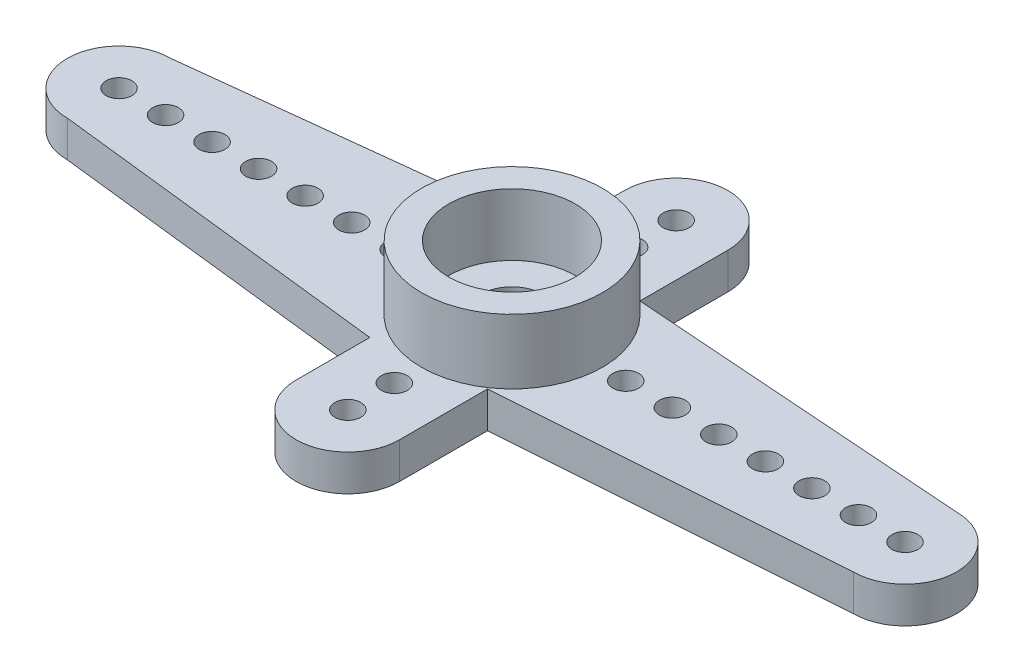
ISO-10303-21;
HEADER;
FILE_DESCRIPTION(('STEP AP214'),'2;1');
FILE_NAME('part.step','',(''),(''),'','','');
FILE_SCHEMA(('AUTOMOTIVE_DESIGN { 1 0 10303 214 1 1 1 1 }'));
ENDSEC;
DATA;
#1=APPLICATION_CONTEXT('core data for automotive mechanical design processes');
#2=APPLICATION_PROTOCOL_DEFINITION('international standard','automotive_design',2000,#1);
#3=PRODUCT_CONTEXT('',#1,'mechanical');
#4=PRODUCT('Part','Part','',(#3));
#5=PRODUCT_RELATED_PRODUCT_CATEGORY('part','',(#4));
#6=PRODUCT_DEFINITION_FORMATION('','',#4);
#7=PRODUCT_DEFINITION_CONTEXT('part definition',#1,'design');
#8=PRODUCT_DEFINITION('design','',#6,#7);
#9=PRODUCT_DEFINITION_SHAPE('','',#8);
#10=(LENGTH_UNIT() NAMED_UNIT(*) SI_UNIT(.MILLI.,.METRE.));
#11=(NAMED_UNIT(*) PLANE_ANGLE_UNIT() SI_UNIT($,.RADIAN.));
#12=(NAMED_UNIT(*) SI_UNIT($,.STERADIAN.) SOLID_ANGLE_UNIT());
#13=UNCERTAINTY_MEASURE_WITH_UNIT(LENGTH_MEASURE(1.E-05),#10,'distance_accuracy_value','');
#14=(GEOMETRIC_REPRESENTATION_CONTEXT(3) GLOBAL_UNCERTAINTY_ASSIGNED_CONTEXT((#13)) GLOBAL_UNIT_ASSIGNED_CONTEXT((#10,
#11,#12)) REPRESENTATION_CONTEXT('',''));
#15=CARTESIAN_POINT('',(0.,0.,0.));
#16=DIRECTION('',(0.,0.,1.));
#17=DIRECTION('',(1.,0.,0.));
#18=AXIS2_PLACEMENT_3D('',#15,#16,#17);
#19=CARTESIAN_POINT('',(1.86858471289894,3.9,-2.95945791838985));
#20=DIRECTION('',(0.0717840294641295,0.,-0.997420198870011));
#21=DIRECTION('',(-0.997420198870011,0.,-0.0717840294641295));
#22=AXIS2_PLACEMENT_3D('',#19,#20,#21);
#23=PLANE('',#22);
#24=DIRECTION('',(0.997420198870011,0.,0.0717840294641295));
#25=VECTOR('',#24,1.);
#26=CARTESIAN_POINT('',(1.86858471289894,0.,-2.95945791838985));
#27=LINE('',#26,#25);
#28=CARTESIAN_POINT('',(2.,0.,-2.95));
#29=VERTEX_POINT('',#28);
#30=CARTESIAN_POINT('',(15.2,0.,-2.));
#31=VERTEX_POINT('',#30);
#32=EDGE_CURVE('E151',#29,#31,#27,.T.);
#33=ORIENTED_EDGE('',*,*,#32,.F.);
#34=DIRECTION('',(0.,-1.,0.));
#35=VECTOR('',#34,1.);
#36=CARTESIAN_POINT('',(2.,1.4,-2.95));
#37=LINE('',#36,#35);
#38=CARTESIAN_POINT('',(2.,1.4,-2.95));
#39=VERTEX_POINT('',#38);
#40=EDGE_CURVE('E136',#39,#29,#37,.T.);
#41=ORIENTED_EDGE('',*,*,#40,.F.);
#42=DIRECTION('',(-0.997420198870011,0.,-0.0717840294641295));
#43=VECTOR('',#42,1.);
#44=CARTESIAN_POINT('',(-14.9001527327747,1.4,-4.16629887091939));
#45=LINE('',#44,#43);
#46=CARTESIAN_POINT('',(15.2,1.4,-2.));
#47=VERTEX_POINT('',#46);
#48=EDGE_CURVE('E149',#47,#39,#45,.T.);
#49=ORIENTED_EDGE('',*,*,#48,.F.);
#50=DIRECTION('',(0.,-1.,0.));
#51=VECTOR('',#50,1.);
#52=CARTESIAN_POINT('',(15.2,1.4,-2.00000000000001));
#53=LINE('',#52,#51);
#54=EDGE_CURVE('E243',#47,#31,#53,.T.);
#55=ORIENTED_EDGE('',*,*,#54,.T.);
#56=EDGE_LOOP('',(#33,#41,#49,#55));
#57=FACE_BOUND('',#56,.T.);
#58=ADVANCED_FACE('F41',(#57),#23,.T.);
#59=CARTESIAN_POINT('',(15.2,3.9,2.));
#60=DIRECTION('',(0.0717840294641297,0.,0.997420198870011));
#61=DIRECTION('',(0.997420198870011,0.,-0.0717840294641297));
#62=AXIS2_PLACEMENT_3D('',#59,#60,#61);
#63=PLANE('',#62);
#64=DIRECTION('',(0.997420198870011,0.,-0.0717840294641297));
#65=VECTOR('',#64,1.);
#66=CARTESIAN_POINT('',(-14.9001527327747,1.4,4.16629887091939));
#67=LINE('',#66,#65);
#68=CARTESIAN_POINT('',(2.,1.4,2.95));
#69=VERTEX_POINT('',#68);
#70=CARTESIAN_POINT('',(15.2,1.4,2.));
#71=VERTEX_POINT('',#70);
#72=EDGE_CURVE('E160',#69,#71,#67,.T.);
#73=ORIENTED_EDGE('',*,*,#72,.F.);
#74=DIRECTION('',(0.,-1.,0.));
#75=VECTOR('',#74,1.);
#76=CARTESIAN_POINT('',(2.,1.4,2.95));
#77=LINE('',#76,#75);
#78=CARTESIAN_POINT('',(2.00000000000001,0.,2.95));
#79=VERTEX_POINT('',#78);
#80=EDGE_CURVE('E288',#69,#79,#77,.T.);
#81=ORIENTED_EDGE('',*,*,#80,.T.);
#82=DIRECTION('',(-0.997420198870011,0.,0.0717840294641296));
#83=VECTOR('',#82,1.);
#84=CARTESIAN_POINT('',(15.2,0.,2.));
#85=LINE('',#84,#83);
#86=CARTESIAN_POINT('',(15.2,0.,1.99999999999999));
#87=VERTEX_POINT('',#86);
#88=EDGE_CURVE('E64',#87,#79,#85,.T.);
#89=ORIENTED_EDGE('',*,*,#88,.F.);
#90=DIRECTION('',(0.,-1.,0.));
#91=VECTOR('',#90,1.);
#92=CARTESIAN_POINT('',(15.2,1.4,1.99999999999999));
#93=LINE('',#92,#91);
#94=EDGE_CURVE('E50',#71,#87,#93,.T.);
#95=ORIENTED_EDGE('',*,*,#94,.F.);
#96=EDGE_LOOP('',(#73,#81,#89,#95));
#97=FACE_BOUND('',#96,.T.);
#98=ADVANCED_FACE('F450',(#97),#63,.T.);
#99=CARTESIAN_POINT('',(-15.2,1.4,0.));
#100=DIRECTION('',(0.,1.,0.));
#101=DIRECTION('',(0.,0.,1.));
#102=AXIS2_PLACEMENT_3D('',#99,#100,#101);
#103=PLANE('',#102);
#104=ORIENTED_EDGE('',*,*,#48,.T.);
#105=DIRECTION('',(0.,0.,-1.));
#106=VECTOR('',#105,1.);
#107=CARTESIAN_POINT('',(2.,1.4,-6.34999999999999));
#108=LINE('',#107,#106);
#109=CARTESIAN_POINT('',(2.,1.4,-6.34999999999999));
#110=VERTEX_POINT('',#109);
#111=EDGE_CURVE('E133',#39,#110,#108,.T.);
#112=ORIENTED_EDGE('',*,*,#111,.T.);
#113=CARTESIAN_POINT('',(0.,1.4,-6.34999999999999));
#114=DIRECTION('',(0.,1.,0.));
#115=DIRECTION('',(0.,0.,1.));
#116=AXIS2_PLACEMENT_3D('',#113,#114,#115);
#117=CIRCLE('',#116,1.99999999999999);
#118=CARTESIAN_POINT('',(-1.99999999999998,1.4,-6.34999999999999));
#119=VERTEX_POINT('',#118);
#120=EDGE_CURVE('E144',#110,#119,#117,.T.);
#121=ORIENTED_EDGE('',*,*,#120,.T.);
#122=DIRECTION('',(0.,0.,1.));
#123=VECTOR('',#122,1.);
#124=CARTESIAN_POINT('',(-1.99999999999999,1.4,-6.34999999999999));
#125=LINE('',#124,#123);
#126=CARTESIAN_POINT('',(-2.,1.4,-3.5));
#127=VERTEX_POINT('',#126);
#128=EDGE_CURVE('E335',#119,#127,#125,.T.);
#129=ORIENTED_EDGE('',*,*,#128,.T.);
#130=DIRECTION('',(-0.993605254789719,0.,0.112909688044287));
#131=VECTOR('',#130,1.);
#132=CARTESIAN_POINT('',(-15.2,1.4,-1.99999999999999));
#133=LINE('',#132,#131);
#134=CARTESIAN_POINT('',(-15.2,1.4,-1.99999999999999));
#135=VERTEX_POINT('',#134);
#136=EDGE_CURVE('E332',#127,#135,#133,.T.);
#137=ORIENTED_EDGE('',*,*,#136,.T.);
#138=CARTESIAN_POINT('',(-15.2,1.4,0.));
#139=DIRECTION('',(0.,1.,0.));
#140=DIRECTION('',(0.,0.,1.));
#141=AXIS2_PLACEMENT_3D('',#138,#139,#140);
#142=CIRCLE('',#141,2.);
#143=CARTESIAN_POINT('',(-15.2,1.4,2.00000000000001));
#144=VERTEX_POINT('',#143);
#145=EDGE_CURVE('E329',#135,#144,#142,.T.);
#146=ORIENTED_EDGE('',*,*,#145,.T.);
#147=DIRECTION('',(0.993605254789719,0.,0.112909688044286));
#148=VECTOR('',#147,1.);
#149=CARTESIAN_POINT('',(-15.2,1.4,2.00000000000001));
#150=LINE('',#149,#148);
#151=CARTESIAN_POINT('',(-2.,1.4,3.5));
#152=VERTEX_POINT('',#151);
#153=EDGE_CURVE('E326',#144,#152,#150,.T.);
#154=ORIENTED_EDGE('',*,*,#153,.T.);
#155=DIRECTION('',(0.,0.,1.));
#156=VECTOR('',#155,1.);
#157=CARTESIAN_POINT('',(-2.,1.4,6.35));
#158=LINE('',#157,#156);
#159=CARTESIAN_POINT('',(-2.,1.4,6.35));
#160=VERTEX_POINT('',#159);
#161=EDGE_CURVE('E323',#152,#160,#158,.T.);
#162=ORIENTED_EDGE('',*,*,#161,.T.);
#163=CARTESIAN_POINT('',(0.,1.4,6.35));
#164=DIRECTION('',(0.,1.,0.));
#165=DIRECTION('',(0.,0.,-1.));
#166=AXIS2_PLACEMENT_3D('',#163,#164,#165);
#167=CIRCLE('',#166,2.);
#168=CARTESIAN_POINT('',(2.,1.4,6.35));
#169=VERTEX_POINT('',#168);
#170=EDGE_CURVE('E320',#160,#169,#167,.T.);
#171=ORIENTED_EDGE('',*,*,#170,.T.);
#172=DIRECTION('',(0.,0.,-1.));
#173=VECTOR('',#172,1.);
#174=CARTESIAN_POINT('',(2.,1.4,6.35));
#175=LINE('',#174,#173);
#176=EDGE_CURVE('E291',#169,#69,#175,.T.);
#177=ORIENTED_EDGE('',*,*,#176,.T.);
#178=ORIENTED_EDGE('',*,*,#72,.T.);
#179=CARTESIAN_POINT('',(15.2,1.4,0.));
#180=DIRECTION('',(0.,1.,0.));
#181=DIRECTION('',(0.,0.,-1.));
#182=AXIS2_PLACEMENT_3D('',#179,#180,#181);
#183=CIRCLE('',#182,2.);
#184=EDGE_CURVE('E157',#71,#47,#183,.T.);
#185=ORIENTED_EDGE('',*,*,#184,.T.);
#186=EDGE_LOOP('',(#104,#112,#121,#129,#137,#146,#154,#162,#171,#177,#178,#185));
#187=FACE_BOUND('',#186,.T.);
#188=CARTESIAN_POINT('',(6.2,1.4,0.));
#189=DIRECTION('',(0.,1.,0.));
#190=DIRECTION('',(0.,0.,1.));
#191=AXIS2_PLACEMENT_3D('',#188,#189,#190);
#192=CIRCLE('',#191,0.499999999999997);
#193=CARTESIAN_POINT('',(6.2,1.4,0.500000000000053));
#194=VERTEX_POINT('',#193);
#195=EDGE_CURVE('E193',#194,#194,#192,.T.);
#196=ORIENTED_EDGE('',*,*,#195,.F.);
#197=EDGE_LOOP('',(#196));
#198=FACE_BOUND('',#197,.T.);
#199=CARTESIAN_POINT('',(9.8,1.4,0.));
#200=DIRECTION('',(0.,1.,0.));
#201=DIRECTION('',(0.,0.,1.));
#202=AXIS2_PLACEMENT_3D('',#199,#200,#201);
#203=CIRCLE('',#202,0.499999999999997);
#204=CARTESIAN_POINT('',(9.8,1.4,0.500000000000028));
#205=VERTEX_POINT('',#204);
#206=EDGE_CURVE('E209',#205,#205,#203,.T.);
#207=ORIENTED_EDGE('',*,*,#206,.F.);
#208=EDGE_LOOP('',(#207));
#209=FACE_BOUND('',#208,.T.);
#210=CARTESIAN_POINT('',(13.4,1.4,0.));
#211=DIRECTION('',(0.,1.,0.));
#212=DIRECTION('',(0.,0.,1.));
#213=AXIS2_PLACEMENT_3D('',#210,#211,#212);
#214=CIRCLE('',#213,0.499999999999997);
#215=CARTESIAN_POINT('',(13.4,1.4,0.500000000000003));
#216=VERTEX_POINT('',#215);
#217=EDGE_CURVE('E225',#216,#216,#214,.T.);
#218=ORIENTED_EDGE('',*,*,#217,.F.);
#219=EDGE_LOOP('',(#218));
#220=FACE_BOUND('',#219,.T.);
#221=CARTESIAN_POINT('',(15.2,1.4,0.));
#222=DIRECTION('',(0.,1.,0.));
#223=DIRECTION('',(0.,0.,1.));
#224=AXIS2_PLACEMENT_3D('',#221,#222,#223);
#225=CIRCLE('',#224,0.499999999999997);
#226=CARTESIAN_POINT('',(15.2,1.4,0.49999999999999));
#227=VERTEX_POINT('',#226);
#228=EDGE_CURVE('E233',#227,#227,#225,.T.);
#229=ORIENTED_EDGE('',*,*,#228,.F.);
#230=EDGE_LOOP('',(#229));
#231=FACE_BOUND('',#230,.T.);
#232=CARTESIAN_POINT('',(11.6,1.4,0.));
#233=DIRECTION('',(0.,1.,0.));
#234=DIRECTION('',(0.,0.,1.));
#235=AXIS2_PLACEMENT_3D('',#232,#233,#234);
#236=CIRCLE('',#235,0.499999999999999);
#237=CARTESIAN_POINT('',(11.6,1.4,0.500000000000017));
#238=VERTEX_POINT('',#237);
#239=EDGE_CURVE('E217',#238,#238,#236,.T.);
#240=ORIENTED_EDGE('',*,*,#239,.F.);
#241=EDGE_LOOP('',(#240));
#242=FACE_BOUND('',#241,.T.);
#243=CARTESIAN_POINT('',(8.,1.4,0.));
#244=DIRECTION('',(0.,1.,0.));
#245=DIRECTION('',(0.,0.,1.));
#246=AXIS2_PLACEMENT_3D('',#243,#244,#245);
#247=CIRCLE('',#246,0.499999999999997);
#248=CARTESIAN_POINT('',(8.,1.4,0.500000000000041));
#249=VERTEX_POINT('',#248);
#250=EDGE_CURVE('E201',#249,#249,#247,.T.);
#251=ORIENTED_EDGE('',*,*,#250,.F.);
#252=EDGE_LOOP('',(#251));
#253=FACE_BOUND('',#252,.T.);
#254=CARTESIAN_POINT('',(4.4,1.4,0.));
#255=DIRECTION('',(0.,1.,0.));
#256=DIRECTION('',(0.,0.,1.));
#257=AXIS2_PLACEMENT_3D('',#254,#255,#256);
#258=CIRCLE('',#257,0.499999999999997);
#259=CARTESIAN_POINT('',(4.4,1.4,0.500000000000066));
#260=VERTEX_POINT('',#259);
#261=EDGE_CURVE('E185',#260,#260,#258,.T.);
#262=ORIENTED_EDGE('',*,*,#261,.F.);
#263=EDGE_LOOP('',(#262));
#264=FACE_BOUND('',#263,.T.);
#265=CARTESIAN_POINT('',(0.,1.4,0.));
#266=DIRECTION('',(0.,1.,0.));
#267=DIRECTION('',(0.,0.,1.));
#268=AXIS2_PLACEMENT_3D('',#265,#266,#267);
#269=CIRCLE('',#268,3.5);
#270=CARTESIAN_POINT('',(0.,1.4,3.5));
#271=VERTEX_POINT('',#270);
#272=EDGE_CURVE('E176',#271,#271,#269,.T.);
#273=ORIENTED_EDGE('',*,*,#272,.F.);
#274=EDGE_LOOP('',(#273));
#275=FACE_BOUND('',#274,.T.);
#276=CARTESIAN_POINT('',(-4.4,1.4,0.));
#277=DIRECTION('',(0.,1.,0.));
#278=DIRECTION('',(0.,0.,-1.));
#279=AXIS2_PLACEMENT_3D('',#276,#277,#278);
#280=CIRCLE('',#279,0.499999999999997);
#281=CARTESIAN_POINT('',(-4.4,1.4,-0.500000000000066));
#282=VERTEX_POINT('',#281);
#283=EDGE_CURVE('E416',#282,#282,#280,.T.);
#284=ORIENTED_EDGE('',*,*,#283,.F.);
#285=EDGE_LOOP('',(#284));
#286=FACE_BOUND('',#285,.T.);
#287=CARTESIAN_POINT('',(-8.,1.4,0.));
#288=DIRECTION('',(0.,1.,0.));
#289=DIRECTION('',(0.,0.,-1.));
#290=AXIS2_PLACEMENT_3D('',#287,#288,#289);
#291=CIRCLE('',#290,0.499999999999997);
#292=CARTESIAN_POINT('',(-8.,1.4,-0.500000000000041));
#293=VERTEX_POINT('',#292);
#294=EDGE_CURVE('E400',#293,#293,#291,.T.);
#295=ORIENTED_EDGE('',*,*,#294,.F.);
#296=EDGE_LOOP('',(#295));
#297=FACE_BOUND('',#296,.T.);
#298=CARTESIAN_POINT('',(-11.6,1.4,0.));
#299=DIRECTION('',(0.,1.,0.));
#300=DIRECTION('',(0.,0.,-1.));
#301=AXIS2_PLACEMENT_3D('',#298,#299,#300);
#302=CIRCLE('',#301,0.499999999999999);
#303=CARTESIAN_POINT('',(-11.6,1.4,-0.500000000000017));
#304=VERTEX_POINT('',#303);
#305=EDGE_CURVE('E384',#304,#304,#302,.T.);
#306=ORIENTED_EDGE('',*,*,#305,.F.);
#307=EDGE_LOOP('',(#306));
#308=FACE_BOUND('',#307,.T.);
#309=CARTESIAN_POINT('',(0.,1.4,-6.34999999999999));
#310=DIRECTION('',(0.,1.,0.));
#311=DIRECTION('',(0.,0.,1.));
#312=AXIS2_PLACEMENT_3D('',#309,#310,#311);
#313=CIRCLE('',#312,0.5);
#314=CARTESIAN_POINT('',(0.,1.4,-5.84999999999999));
#315=VERTEX_POINT('',#314);
#316=EDGE_CURVE('E368',#315,#315,#313,.T.);
#317=ORIENTED_EDGE('',*,*,#316,.F.);
#318=EDGE_LOOP('',(#317));
#319=FACE_BOUND('',#318,.T.);
#320=CARTESIAN_POINT('',(0.,1.4,-4.54999999999999));
#321=DIRECTION('',(0.,1.,0.));
#322=DIRECTION('',(0.,0.,1.));
#323=AXIS2_PLACEMENT_3D('',#320,#321,#322);
#324=CIRCLE('',#323,0.5);
#325=CARTESIAN_POINT('',(0.,1.4,-4.04999999999999));
#326=VERTEX_POINT('',#325);
#327=EDGE_CURVE('E360',#326,#326,#324,.T.);
#328=ORIENTED_EDGE('',*,*,#327,.F.);
#329=EDGE_LOOP('',(#328));
#330=FACE_BOUND('',#329,.T.);
#331=CARTESIAN_POINT('',(0.,1.4,4.55));
#332=DIRECTION('',(0.,1.,0.));
#333=DIRECTION('',(0.,0.,-1.));
#334=AXIS2_PLACEMENT_3D('',#331,#332,#333);
#335=CIRCLE('',#334,0.5);
#336=CARTESIAN_POINT('',(0.,1.4,4.05));
#337=VERTEX_POINT('',#336);
#338=EDGE_CURVE('E344',#337,#337,#335,.T.);
#339=ORIENTED_EDGE('',*,*,#338,.F.);
#340=EDGE_LOOP('',(#339));
#341=FACE_BOUND('',#340,.T.);
#342=CARTESIAN_POINT('',(-15.2,1.4,0.));
#343=DIRECTION('',(0.,1.,0.));
#344=DIRECTION('',(0.,0.,-1.));
#345=AXIS2_PLACEMENT_3D('',#342,#343,#344);
#346=CIRCLE('',#345,0.499999999999997);
#347=CARTESIAN_POINT('',(-15.2,1.4,-0.49999999999999));
#348=VERTEX_POINT('',#347);
#349=EDGE_CURVE('E317',#348,#348,#346,.T.);
#350=ORIENTED_EDGE('',*,*,#349,.F.);
#351=EDGE_LOOP('',(#350));
#352=FACE_BOUND('',#351,.T.);
#353=CARTESIAN_POINT('',(0.,1.4,6.35));
#354=DIRECTION('',(0.,1.,0.));
#355=DIRECTION('',(0.,0.,-1.));
#356=AXIS2_PLACEMENT_3D('',#353,#354,#355);
#357=CIRCLE('',#356,0.5);
#358=CARTESIAN_POINT('',(0.,1.4,5.85));
#359=VERTEX_POINT('',#358);
#360=EDGE_CURVE('E352',#359,#359,#357,.T.);
#361=ORIENTED_EDGE('',*,*,#360,.F.);
#362=EDGE_LOOP('',(#361));
#363=FACE_BOUND('',#362,.T.);
#364=CARTESIAN_POINT('',(-13.4,1.4,0.));
#365=DIRECTION('',(0.,1.,0.));
#366=DIRECTION('',(0.,0.,-1.));
#367=AXIS2_PLACEMENT_3D('',#364,#365,#366);
#368=CIRCLE('',#367,0.499999999999997);
#369=CARTESIAN_POINT('',(-13.4,1.4,-0.500000000000003));
#370=VERTEX_POINT('',#369);
#371=EDGE_CURVE('E376',#370,#370,#368,.T.);
#372=ORIENTED_EDGE('',*,*,#371,.F.);
#373=EDGE_LOOP('',(#372));
#374=FACE_BOUND('',#373,.T.);
#375=CARTESIAN_POINT('',(-9.8,1.4,0.));
#376=DIRECTION('',(0.,1.,0.));
#377=DIRECTION('',(0.,0.,-1.));
#378=AXIS2_PLACEMENT_3D('',#375,#376,#377);
#379=CIRCLE('',#378,0.499999999999997);
#380=CARTESIAN_POINT('',(-9.8,1.4,-0.500000000000028));
#381=VERTEX_POINT('',#380);
#382=EDGE_CURVE('E392',#381,#381,#379,.T.);
#383=ORIENTED_EDGE('',*,*,#382,.F.);
#384=EDGE_LOOP('',(#383));
#385=FACE_BOUND('',#384,.T.);
#386=CARTESIAN_POINT('',(-6.2,1.4,0.));
#387=DIRECTION('',(0.,1.,0.));
#388=DIRECTION('',(0.,0.,-1.));
#389=AXIS2_PLACEMENT_3D('',#386,#387,#388);
#390=CIRCLE('',#389,0.499999999999997);
#391=CARTESIAN_POINT('',(-6.2,1.4,-0.500000000000053));
#392=VERTEX_POINT('',#391);
#393=EDGE_CURVE('E408',#392,#392,#390,.T.);
#394=ORIENTED_EDGE('',*,*,#393,.F.);
#395=EDGE_LOOP('',(#394));
#396=FACE_BOUND('',#395,.T.);
#397=ADVANCED_FACE('F154',(#187,#198,#209,#220,#231,#242,#253,#264,#275,#286,#297,#308,#319,
#330,#341,#352,#363,#374,#385,#396),#103,.T.);
#398=CARTESIAN_POINT('',(-15.2,0.,0.));
#399=DIRECTION('',(0.,1.,0.));
#400=DIRECTION('',(0.,0.,1.));
#401=AXIS2_PLACEMENT_3D('',#398,#399,#400);
#402=PLANE('',#401);
#403=CARTESIAN_POINT('',(0.,0.,0.));
#404=DIRECTION('',(0.,1.,0.));
#405=DIRECTION('',(0.,0.,1.));
#406=AXIS2_PLACEMENT_3D('',#403,#404,#405);
#407=CIRCLE('',#406,1.2);
#408=CARTESIAN_POINT('',(0.,0.,1.2));
#409=VERTEX_POINT('',#408);
#410=EDGE_CURVE('E424',#409,#409,#407,.T.);
#411=ORIENTED_EDGE('',*,*,#410,.T.);
#412=EDGE_LOOP('',(#411));
#413=FACE_BOUND('',#412,.T.);
#414=DIRECTION('',(0.,0.,-1.));
#415=VECTOR('',#414,1.);
#416=CARTESIAN_POINT('',(2.,0.,-6.34999999999999));
#417=LINE('',#416,#415);
#418=CARTESIAN_POINT('',(2.,0.,-6.34999999999999));
#419=VERTEX_POINT('',#418);
#420=EDGE_CURVE('E256',#29,#419,#417,.T.);
#421=ORIENTED_EDGE('',*,*,#420,.F.);
#422=ORIENTED_EDGE('',*,*,#32,.T.);
#423=CARTESIAN_POINT('',(15.2,0.,0.));
#424=DIRECTION('',(0.,1.,0.));
#425=DIRECTION('',(0.,0.,-1.));
#426=AXIS2_PLACEMENT_3D('',#423,#424,#425);
#427=CIRCLE('',#426,2.);
#428=EDGE_CURVE('E237',#87,#31,#427,.T.);
#429=ORIENTED_EDGE('',*,*,#428,.F.);
#430=ORIENTED_EDGE('',*,*,#88,.T.);
#431=DIRECTION('',(0.,0.,-1.));
#432=VECTOR('',#431,1.);
#433=CARTESIAN_POINT('',(2.,0.,6.35));
#434=LINE('',#433,#432);
#435=CARTESIAN_POINT('',(2.,0.,6.35));
#436=VERTEX_POINT('',#435);
#437=EDGE_CURVE('E57',#436,#79,#434,.T.);
#438=ORIENTED_EDGE('',*,*,#437,.F.);
#439=CARTESIAN_POINT('',(0.,0.,6.35));
#440=DIRECTION('',(0.,1.,0.));
#441=DIRECTION('',(0.,0.,-1.));
#442=AXIS2_PLACEMENT_3D('',#439,#440,#441);
#443=CIRCLE('',#442,2.);
#444=CARTESIAN_POINT('',(-2.,0.,6.35));
#445=VERTEX_POINT('',#444);
#446=EDGE_CURVE('E294',#445,#436,#443,.T.);
#447=ORIENTED_EDGE('',*,*,#446,.F.);
#448=DIRECTION('',(0.,0.,1.));
#449=VECTOR('',#448,1.);
#450=CARTESIAN_POINT('',(-2.,0.,6.35));
#451=LINE('',#450,#449);
#452=CARTESIAN_POINT('',(-2.,0.,3.5));
#453=VERTEX_POINT('',#452);
#454=EDGE_CURVE('E297',#453,#445,#451,.T.);
#455=ORIENTED_EDGE('',*,*,#454,.F.);
#456=DIRECTION('',(0.993605254789719,0.,0.112909688044286));
#457=VECTOR('',#456,1.);
#458=CARTESIAN_POINT('',(-15.2,0.,2.00000000000001));
#459=LINE('',#458,#457);
#460=CARTESIAN_POINT('',(-15.2,0.,2.00000000000001));
#461=VERTEX_POINT('',#460);
#462=EDGE_CURVE('E300',#461,#453,#459,.T.);
#463=ORIENTED_EDGE('',*,*,#462,.F.);
#464=CARTESIAN_POINT('',(-15.2,0.,0.));
#465=DIRECTION('',(0.,1.,0.));
#466=DIRECTION('',(0.,0.,1.));
#467=AXIS2_PLACEMENT_3D('',#464,#465,#466);
#468=CIRCLE('',#467,2.);
#469=CARTESIAN_POINT('',(-15.2,0.,-1.99999999999999));
#470=VERTEX_POINT('',#469);
#471=EDGE_CURVE('E303',#470,#461,#468,.T.);
#472=ORIENTED_EDGE('',*,*,#471,.F.);
#473=DIRECTION('',(-0.993605254789719,0.,0.112909688044287));
#474=VECTOR('',#473,1.);
#475=CARTESIAN_POINT('',(-15.2,0.,-1.99999999999999));
#476=LINE('',#475,#474);
#477=CARTESIAN_POINT('',(-2.,0.,-3.5));
#478=VERTEX_POINT('',#477);
#479=EDGE_CURVE('E306',#478,#470,#476,.T.);
#480=ORIENTED_EDGE('',*,*,#479,.F.);
#481=DIRECTION('',(0.,0.,1.));
#482=VECTOR('',#481,1.);
#483=CARTESIAN_POINT('',(-1.99999999999999,0.,-6.34999999999999));
#484=LINE('',#483,#482);
#485=CARTESIAN_POINT('',(-1.99999999999998,0.,-6.34999999999999));
#486=VERTEX_POINT('',#485);
#487=EDGE_CURVE('E309',#486,#478,#484,.T.);
#488=ORIENTED_EDGE('',*,*,#487,.F.);
#489=CARTESIAN_POINT('',(0.,0.,-6.34999999999999));
#490=DIRECTION('',(0.,1.,0.));
#491=DIRECTION('',(0.,0.,1.));
#492=AXIS2_PLACEMENT_3D('',#489,#490,#491);
#493=CIRCLE('',#492,1.99999999999999);
#494=EDGE_CURVE('E312',#419,#486,#493,.T.);
#495=ORIENTED_EDGE('',*,*,#494,.F.);
#496=EDGE_LOOP('',(#421,#422,#429,#430,#438,#447,#455,#463,#472,#480,#488,#495));
#497=FACE_BOUND('',#496,.T.);
#498=CARTESIAN_POINT('',(15.2,0.,0.));
#499=DIRECTION('',(0.,1.,0.));
#500=DIRECTION('',(0.,0.,1.));
#501=AXIS2_PLACEMENT_3D('',#498,#499,#500);
#502=CIRCLE('',#501,0.499999999999997);
#503=CARTESIAN_POINT('',(15.2,0.,0.49999999999999));
#504=VERTEX_POINT('',#503);
#505=EDGE_CURVE('E229',#504,#504,#502,.T.);
#506=ORIENTED_EDGE('',*,*,#505,.T.);
#507=EDGE_LOOP('',(#506));
#508=FACE_BOUND('',#507,.T.);
#509=CARTESIAN_POINT('',(13.4,0.,0.));
#510=DIRECTION('',(0.,1.,0.));
#511=DIRECTION('',(0.,0.,1.));
#512=AXIS2_PLACEMENT_3D('',#509,#510,#511);
#513=CIRCLE('',#512,0.499999999999997);
#514=CARTESIAN_POINT('',(13.4,0.,0.500000000000003));
#515=VERTEX_POINT('',#514);
#516=EDGE_CURVE('E221',#515,#515,#513,.T.);
#517=ORIENTED_EDGE('',*,*,#516,.T.);
#518=EDGE_LOOP('',(#517));
#519=FACE_BOUND('',#518,.T.);
#520=CARTESIAN_POINT('',(11.6,0.,0.));
#521=DIRECTION('',(0.,1.,0.));
#522=DIRECTION('',(0.,0.,1.));
#523=AXIS2_PLACEMENT_3D('',#520,#521,#522);
#524=CIRCLE('',#523,0.499999999999999);
#525=CARTESIAN_POINT('',(11.6,0.,0.500000000000017));
#526=VERTEX_POINT('',#525);
#527=EDGE_CURVE('E213',#526,#526,#524,.T.);
#528=ORIENTED_EDGE('',*,*,#527,.T.);
#529=EDGE_LOOP('',(#528));
#530=FACE_BOUND('',#529,.T.);
#531=CARTESIAN_POINT('',(9.8,0.,0.));
#532=DIRECTION('',(0.,1.,0.));
#533=DIRECTION('',(0.,0.,1.));
#534=AXIS2_PLACEMENT_3D('',#531,#532,#533);
#535=CIRCLE('',#534,0.499999999999997);
#536=CARTESIAN_POINT('',(9.8,0.,0.500000000000028));
#537=VERTEX_POINT('',#536);
#538=EDGE_CURVE('E205',#537,#537,#535,.T.);
#539=ORIENTED_EDGE('',*,*,#538,.T.);
#540=EDGE_LOOP('',(#539));
#541=FACE_BOUND('',#540,.T.);
#542=CARTESIAN_POINT('',(8.,0.,0.));
#543=DIRECTION('',(0.,1.,0.));
#544=DIRECTION('',(0.,0.,1.));
#545=AXIS2_PLACEMENT_3D('',#542,#543,#544);
#546=CIRCLE('',#545,0.499999999999997);
#547=CARTESIAN_POINT('',(8.,0.,0.500000000000041));
#548=VERTEX_POINT('',#547);
#549=EDGE_CURVE('E197',#548,#548,#546,.T.);
#550=ORIENTED_EDGE('',*,*,#549,.T.);
#551=EDGE_LOOP('',(#550));
#552=FACE_BOUND('',#551,.T.);
#553=CARTESIAN_POINT('',(6.2,0.,0.));
#554=DIRECTION('',(0.,1.,0.));
#555=DIRECTION('',(0.,0.,1.));
#556=AXIS2_PLACEMENT_3D('',#553,#554,#555);
#557=CIRCLE('',#556,0.499999999999997);
#558=CARTESIAN_POINT('',(6.2,0.,0.500000000000053));
#559=VERTEX_POINT('',#558);
#560=EDGE_CURVE('E189',#559,#559,#557,.T.);
#561=ORIENTED_EDGE('',*,*,#560,.T.);
#562=EDGE_LOOP('',(#561));
#563=FACE_BOUND('',#562,.T.);
#564=CARTESIAN_POINT('',(4.4,0.,0.));
#565=DIRECTION('',(0.,1.,0.));
#566=DIRECTION('',(0.,0.,1.));
#567=AXIS2_PLACEMENT_3D('',#564,#565,#566);
#568=CIRCLE('',#567,0.499999999999997);
#569=CARTESIAN_POINT('',(4.4,0.,0.500000000000066));
#570=VERTEX_POINT('',#569);
#571=EDGE_CURVE('E181',#570,#570,#568,.T.);
#572=ORIENTED_EDGE('',*,*,#571,.T.);
#573=EDGE_LOOP('',(#572));
#574=FACE_BOUND('',#573,.T.);
#575=CARTESIAN_POINT('',(-15.2,0.,0.));
#576=DIRECTION('',(0.,1.,0.));
#577=DIRECTION('',(0.,0.,-1.));
#578=AXIS2_PLACEMENT_3D('',#575,#576,#577);
#579=CIRCLE('',#578,0.499999999999997);
#580=CARTESIAN_POINT('',(-15.2,0.,-0.49999999999999));
#581=VERTEX_POINT('',#580);
#582=EDGE_CURVE('E340',#581,#581,#579,.T.);
#583=ORIENTED_EDGE('',*,*,#582,.T.);
#584=EDGE_LOOP('',(#583));
#585=FACE_BOUND('',#584,.T.);
#586=CARTESIAN_POINT('',(0.,0.,4.55));
#587=DIRECTION('',(0.,1.,0.));
#588=DIRECTION('',(0.,0.,-1.));
#589=AXIS2_PLACEMENT_3D('',#586,#587,#588);
#590=CIRCLE('',#589,0.5);
#591=CARTESIAN_POINT('',(0.,0.,4.05));
#592=VERTEX_POINT('',#591);
#593=EDGE_CURVE('E348',#592,#592,#590,.T.);
#594=ORIENTED_EDGE('',*,*,#593,.T.);
#595=EDGE_LOOP('',(#594));
#596=FACE_BOUND('',#595,.T.);
#597=CARTESIAN_POINT('',(0.,0.,6.35));
#598=DIRECTION('',(0.,1.,0.));
#599=DIRECTION('',(0.,0.,-1.));
#600=AXIS2_PLACEMENT_3D('',#597,#598,#599);
#601=CIRCLE('',#600,0.5);
#602=CARTESIAN_POINT('',(0.,0.,5.85));
#603=VERTEX_POINT('',#602);
#604=EDGE_CURVE('E356',#603,#603,#601,.T.);
#605=ORIENTED_EDGE('',*,*,#604,.T.);
#606=EDGE_LOOP('',(#605));
#607=FACE_BOUND('',#606,.T.);
#608=CARTESIAN_POINT('',(0.,0.,-4.54999999999999));
#609=DIRECTION('',(0.,1.,0.));
#610=DIRECTION('',(0.,0.,1.));
#611=AXIS2_PLACEMENT_3D('',#608,#609,#610);
#612=CIRCLE('',#611,0.5);
#613=CARTESIAN_POINT('',(0.,0.,-4.04999999999999));
#614=VERTEX_POINT('',#613);
#615=EDGE_CURVE('E364',#614,#614,#612,.T.);
#616=ORIENTED_EDGE('',*,*,#615,.T.);
#617=EDGE_LOOP('',(#616));
#618=FACE_BOUND('',#617,.T.);
#619=CARTESIAN_POINT('',(0.,0.,-6.34999999999999));
#620=DIRECTION('',(0.,1.,0.));
#621=DIRECTION('',(0.,0.,1.));
#622=AXIS2_PLACEMENT_3D('',#619,#620,#621);
#623=CIRCLE('',#622,0.5);
#624=CARTESIAN_POINT('',(0.,0.,-5.84999999999999));
#625=VERTEX_POINT('',#624);
#626=EDGE_CURVE('E372',#625,#625,#623,.T.);
#627=ORIENTED_EDGE('',*,*,#626,.T.);
#628=EDGE_LOOP('',(#627));
#629=FACE_BOUND('',#628,.T.);
#630=CARTESIAN_POINT('',(-13.4,0.,0.));
#631=DIRECTION('',(0.,1.,0.));
#632=DIRECTION('',(0.,0.,-1.));
#633=AXIS2_PLACEMENT_3D('',#630,#631,#632);
#634=CIRCLE('',#633,0.499999999999997);
#635=CARTESIAN_POINT('',(-13.4,0.,-0.500000000000003));
#636=VERTEX_POINT('',#635);
#637=EDGE_CURVE('E380',#636,#636,#634,.T.);
#638=ORIENTED_EDGE('',*,*,#637,.T.);
#639=EDGE_LOOP('',(#638));
#640=FACE_BOUND('',#639,.T.);
#641=CARTESIAN_POINT('',(-11.6,0.,0.));
#642=DIRECTION('',(0.,1.,0.));
#643=DIRECTION('',(0.,0.,-1.));
#644=AXIS2_PLACEMENT_3D('',#641,#642,#643);
#645=CIRCLE('',#644,0.499999999999999);
#646=CARTESIAN_POINT('',(-11.6,0.,-0.500000000000017));
#647=VERTEX_POINT('',#646);
#648=EDGE_CURVE('E388',#647,#647,#645,.T.);
#649=ORIENTED_EDGE('',*,*,#648,.T.);
#650=EDGE_LOOP('',(#649));
#651=FACE_BOUND('',#650,.T.);
#652=CARTESIAN_POINT('',(-9.8,0.,0.));
#653=DIRECTION('',(0.,1.,0.));
#654=DIRECTION('',(0.,0.,-1.));
#655=AXIS2_PLACEMENT_3D('',#652,#653,#654);
#656=CIRCLE('',#655,0.499999999999997);
#657=CARTESIAN_POINT('',(-9.8,0.,-0.500000000000028));
#658=VERTEX_POINT('',#657);
#659=EDGE_CURVE('E396',#658,#658,#656,.T.);
#660=ORIENTED_EDGE('',*,*,#659,.T.);
#661=EDGE_LOOP('',(#660));
#662=FACE_BOUND('',#661,.T.);
#663=CARTESIAN_POINT('',(-8.,0.,0.));
#664=DIRECTION('',(0.,1.,0.));
#665=DIRECTION('',(0.,0.,-1.));
#666=AXIS2_PLACEMENT_3D('',#663,#664,#665);
#667=CIRCLE('',#666,0.499999999999997);
#668=CARTESIAN_POINT('',(-8.,0.,-0.500000000000041));
#669=VERTEX_POINT('',#668);
#670=EDGE_CURVE('E404',#669,#669,#667,.T.);
#671=ORIENTED_EDGE('',*,*,#670,.T.);
#672=EDGE_LOOP('',(#671));
#673=FACE_BOUND('',#672,.T.);
#674=CARTESIAN_POINT('',(-6.2,0.,0.));
#675=DIRECTION('',(0.,1.,0.));
#676=DIRECTION('',(0.,0.,-1.));
#677=AXIS2_PLACEMENT_3D('',#674,#675,#676);
#678=CIRCLE('',#677,0.499999999999997);
#679=CARTESIAN_POINT('',(-6.2,0.,-0.500000000000053));
#680=VERTEX_POINT('',#679);
#681=EDGE_CURVE('E412',#680,#680,#678,.T.);
#682=ORIENTED_EDGE('',*,*,#681,.T.);
#683=EDGE_LOOP('',(#682));
#684=FACE_BOUND('',#683,.T.);
#685=CARTESIAN_POINT('',(-4.4,0.,0.));
#686=DIRECTION('',(0.,1.,0.));
#687=DIRECTION('',(0.,0.,-1.));
#688=AXIS2_PLACEMENT_3D('',#685,#686,#687);
#689=CIRCLE('',#688,0.499999999999997);
#690=CARTESIAN_POINT('',(-4.4,0.,-0.500000000000066));
#691=VERTEX_POINT('',#690);
#692=EDGE_CURVE('E420',#691,#691,#689,.T.);
#693=ORIENTED_EDGE('',*,*,#692,.T.);
#694=EDGE_LOOP('',(#693));
#695=FACE_BOUND('',#694,.T.);
#696=ADVANCED_FACE('F253',(#413,#497,#508,#519,#530,#541,#552,#563,#574,#585,#596,#607,#618,
#629,#640,#651,#662,#673,#684,#695),#402,.F.);
#697=CARTESIAN_POINT('',(15.2,1.4,0.));
#698=DIRECTION('',(0.,-1.,0.));
#699=DIRECTION('',(0.,0.,-1.));
#700=AXIS2_PLACEMENT_3D('',#697,#698,#699);
#701=CYLINDRICAL_SURFACE('',#700,2.);
#702=ORIENTED_EDGE('',*,*,#428,.T.);
#703=ORIENTED_EDGE('',*,*,#54,.F.);
#704=ORIENTED_EDGE('',*,*,#184,.F.);
#705=ORIENTED_EDGE('',*,*,#94,.T.);
#706=EDGE_LOOP('',(#702,#703,#704,#705));
#707=FACE_BOUND('',#706,.T.);
#708=ADVANCED_FACE('F43',(#707),#701,.T.);
#709=CARTESIAN_POINT('',(15.2,1.4,0.));
#710=DIRECTION('',(0.,-1.,0.));
#711=DIRECTION('',(0.,0.,-1.));
#712=AXIS2_PLACEMENT_3D('',#709,#710,#711);
#713=CYLINDRICAL_SURFACE('',#712,0.499999999999997);
#714=ORIENTED_EDGE('',*,*,#228,.T.);
#715=EDGE_LOOP('',(#714));
#716=FACE_BOUND('',#715,.T.);
#717=ORIENTED_EDGE('',*,*,#505,.F.);
#718=EDGE_LOOP('',(#717));
#719=FACE_BOUND('',#718,.T.);
#720=ADVANCED_FACE('F543',(#716,#719),#713,.F.);
#721=CARTESIAN_POINT('',(13.4,1.4,0.));
#722=DIRECTION('',(0.,-1.,0.));
#723=DIRECTION('',(0.,0.,-1.));
#724=AXIS2_PLACEMENT_3D('',#721,#722,#723);
#725=CYLINDRICAL_SURFACE('',#724,0.499999999999997);
#726=ORIENTED_EDGE('',*,*,#217,.T.);
#727=EDGE_LOOP('',(#726));
#728=FACE_BOUND('',#727,.T.);
#729=ORIENTED_EDGE('',*,*,#516,.F.);
#730=EDGE_LOOP('',(#729));
#731=FACE_BOUND('',#730,.T.);
#732=ADVANCED_FACE('F548',(#728,#731),#725,.F.);
#733=CARTESIAN_POINT('',(11.6,1.4,0.));
#734=DIRECTION('',(0.,-1.,0.));
#735=DIRECTION('',(0.,0.,-1.));
#736=AXIS2_PLACEMENT_3D('',#733,#734,#735);
#737=CYLINDRICAL_SURFACE('',#736,0.499999999999999);
#738=ORIENTED_EDGE('',*,*,#239,.T.);
#739=EDGE_LOOP('',(#738));
#740=FACE_BOUND('',#739,.T.);
#741=ORIENTED_EDGE('',*,*,#527,.F.);
#742=EDGE_LOOP('',(#741));
#743=FACE_BOUND('',#742,.T.);
#744=ADVANCED_FACE('F552',(#740,#743),#737,.F.);
#745=CARTESIAN_POINT('',(9.8,1.4,0.));
#746=DIRECTION('',(0.,-1.,0.));
#747=DIRECTION('',(0.,0.,-1.));
#748=AXIS2_PLACEMENT_3D('',#745,#746,#747);
#749=CYLINDRICAL_SURFACE('',#748,0.499999999999997);
#750=ORIENTED_EDGE('',*,*,#206,.T.);
#751=EDGE_LOOP('',(#750));
#752=FACE_BOUND('',#751,.T.);
#753=ORIENTED_EDGE('',*,*,#538,.F.);
#754=EDGE_LOOP('',(#753));
#755=FACE_BOUND('',#754,.T.);
#756=ADVANCED_FACE('F556',(#752,#755),#749,.F.);
#757=CARTESIAN_POINT('',(8.,1.4,0.));
#758=DIRECTION('',(0.,-1.,0.));
#759=DIRECTION('',(0.,0.,-1.));
#760=AXIS2_PLACEMENT_3D('',#757,#758,#759);
#761=CYLINDRICAL_SURFACE('',#760,0.499999999999997);
#762=ORIENTED_EDGE('',*,*,#250,.T.);
#763=EDGE_LOOP('',(#762));
#764=FACE_BOUND('',#763,.T.);
#765=ORIENTED_EDGE('',*,*,#549,.F.);
#766=EDGE_LOOP('',(#765));
#767=FACE_BOUND('',#766,.T.);
#768=ADVANCED_FACE('F560',(#764,#767),#761,.F.);
#769=CARTESIAN_POINT('',(6.2,1.4,0.));
#770=DIRECTION('',(0.,-1.,0.));
#771=DIRECTION('',(0.,0.,-1.));
#772=AXIS2_PLACEMENT_3D('',#769,#770,#771);
#773=CYLINDRICAL_SURFACE('',#772,0.499999999999997);
#774=ORIENTED_EDGE('',*,*,#195,.T.);
#775=EDGE_LOOP('',(#774));
#776=FACE_BOUND('',#775,.T.);
#777=ORIENTED_EDGE('',*,*,#560,.F.);
#778=EDGE_LOOP('',(#777));
#779=FACE_BOUND('',#778,.T.);
#780=ADVANCED_FACE('F564',(#776,#779),#773,.F.);
#781=CARTESIAN_POINT('',(4.4,1.4,0.));
#782=DIRECTION('',(0.,-1.,0.));
#783=DIRECTION('',(0.,0.,-1.));
#784=AXIS2_PLACEMENT_3D('',#781,#782,#783);
#785=CYLINDRICAL_SURFACE('',#784,0.499999999999997);
#786=ORIENTED_EDGE('',*,*,#261,.T.);
#787=EDGE_LOOP('',(#786));
#788=FACE_BOUND('',#787,.T.);
#789=ORIENTED_EDGE('',*,*,#571,.F.);
#790=EDGE_LOOP('',(#789));
#791=FACE_BOUND('',#790,.T.);
#792=ADVANCED_FACE('F568',(#788,#791),#785,.F.);
#793=CARTESIAN_POINT('',(0.,3.9,0.));
#794=DIRECTION('',(0.,1.,0.));
#795=DIRECTION('',(0.,0.,1.));
#796=AXIS2_PLACEMENT_3D('',#793,#794,#795);
#797=PLANE('',#796);
#798=CARTESIAN_POINT('',(0.,3.9,0.));
#799=DIRECTION('',(0.,1.,0.));
#800=DIRECTION('',(0.,0.,1.));
#801=AXIS2_PLACEMENT_3D('',#798,#799,#800);
#802=CIRCLE('',#801,3.5);
#803=CARTESIAN_POINT('',(0.,3.9,3.5));
#804=VERTEX_POINT('',#803);
#805=EDGE_CURVE('E177',#804,#804,#802,.T.);
#806=ORIENTED_EDGE('',*,*,#805,.T.);
#807=EDGE_LOOP('',(#806));
#808=FACE_BOUND('',#807,.T.);
#809=CARTESIAN_POINT('',(0.,3.9,0.));
#810=DIRECTION('',(0.,1.,0.));
#811=DIRECTION('',(0.,0.,1.));
#812=AXIS2_PLACEMENT_3D('',#809,#810,#811);
#813=CIRCLE('',#812,2.45);
#814=CARTESIAN_POINT('',(0.,3.9,2.45));
#815=VERTEX_POINT('',#814);
#816=EDGE_CURVE('E172',#815,#815,#813,.T.);
#817=ORIENTED_EDGE('',*,*,#816,.F.);
#818=EDGE_LOOP('',(#817));
#819=FACE_BOUND('',#818,.T.);
#820=ADVANCED_FACE('F572',(#808,#819),#797,.T.);
#821=CARTESIAN_POINT('',(0.,3.9,0.));
#822=DIRECTION('',(0.,-1.,0.));
#823=DIRECTION('',(0.,0.,-1.));
#824=AXIS2_PLACEMENT_3D('',#821,#822,#823);
#825=CYLINDRICAL_SURFACE('',#824,3.5);
#826=ORIENTED_EDGE('',*,*,#272,.T.);
#827=EDGE_LOOP('',(#826));
#828=FACE_BOUND('',#827,.T.);
#829=ORIENTED_EDGE('',*,*,#805,.F.);
#830=EDGE_LOOP('',(#829));
#831=FACE_BOUND('',#830,.T.);
#832=ADVANCED_FACE('F446',(#828,#831),#825,.T.);
#833=CARTESIAN_POINT('',(0.,3.9,0.));
#834=DIRECTION('',(0.,-1.,0.));
#835=DIRECTION('',(0.,0.,-1.));
#836=AXIS2_PLACEMENT_3D('',#833,#834,#835);
#837=CYLINDRICAL_SURFACE('',#836,2.45);
#838=CARTESIAN_POINT('',(0.,1.5,0.));
#839=DIRECTION('',(0.,1.,0.));
#840=DIRECTION('',(0.,0.,1.));
#841=AXIS2_PLACEMENT_3D('',#838,#839,#840);
#842=CIRCLE('',#841,2.45);
#843=CARTESIAN_POINT('',(0.,1.5,2.45));
#844=VERTEX_POINT('',#843);
#845=EDGE_CURVE('E11',#844,#844,#842,.T.);
#846=ORIENTED_EDGE('',*,*,#845,.F.);
#847=EDGE_LOOP('',(#846));
#848=FACE_BOUND('',#847,.T.);
#849=ORIENTED_EDGE('',*,*,#816,.T.);
#850=EDGE_LOOP('',(#849));
#851=FACE_BOUND('',#850,.T.);
#852=ADVANCED_FACE('F436',(#848,#851),#837,.F.);
#853=CARTESIAN_POINT('',(0.,0.,0.));
#854=DIRECTION('',(0.,1.,0.));
#855=DIRECTION('',(0.,0.,1.));
#856=AXIS2_PLACEMENT_3D('',#853,#854,#855);
#857=CYLINDRICAL_SURFACE('',#856,1.2);
#858=CARTESIAN_POINT('',(0.,1.5,0.));
#859=DIRECTION('',(0.,1.,0.));
#860=DIRECTION('',(0.,0.,1.));
#861=AXIS2_PLACEMENT_3D('',#858,#859,#860);
#862=CIRCLE('',#861,1.2);
#863=CARTESIAN_POINT('',(0.,1.5,1.2));
#864=VERTEX_POINT('',#863);
#865=EDGE_CURVE('E164',#864,#864,#862,.T.);
#866=ORIENTED_EDGE('',*,*,#865,.T.);
#867=EDGE_LOOP('',(#866));
#868=FACE_BOUND('',#867,.T.);
#869=ORIENTED_EDGE('',*,*,#410,.F.);
#870=EDGE_LOOP('',(#869));
#871=FACE_BOUND('',#870,.T.);
#872=ADVANCED_FACE('F433',(#868,#871),#857,.F.);
#873=CARTESIAN_POINT('',(0.,1.5,0.));
#874=DIRECTION('',(0.,1.,0.));
#875=DIRECTION('',(0.,0.,1.));
#876=AXIS2_PLACEMENT_3D('',#873,#874,#875);
#877=PLANE('',#876);
#878=ORIENTED_EDGE('',*,*,#845,.T.);
#879=EDGE_LOOP('',(#878));
#880=FACE_BOUND('',#879,.T.);
#881=ORIENTED_EDGE('',*,*,#865,.F.);
#882=EDGE_LOOP('',(#881));
#883=FACE_BOUND('',#882,.T.);
#884=ADVANCED_FACE('F435',(#880,#883),#877,.T.);
#885=CARTESIAN_POINT('',(-4.4,1.4,0.));
#886=DIRECTION('',(0.,-1.,0.));
#887=DIRECTION('',(0.,0.,-1.));
#888=AXIS2_PLACEMENT_3D('',#885,#886,#887);
#889=CYLINDRICAL_SURFACE('',#888,0.499999999999997);
#890=ORIENTED_EDGE('',*,*,#283,.T.);
#891=EDGE_LOOP('',(#890));
#892=FACE_BOUND('',#891,.T.);
#893=ORIENTED_EDGE('',*,*,#692,.F.);
#894=EDGE_LOOP('',(#893));
#895=FACE_BOUND('',#894,.T.);
#896=ADVANCED_FACE('F443',(#892,#895),#889,.F.);
#897=CARTESIAN_POINT('',(-6.2,1.4,0.));
#898=DIRECTION('',(0.,-1.,0.));
#899=DIRECTION('',(0.,0.,-1.));
#900=AXIS2_PLACEMENT_3D('',#897,#898,#899);
#901=CYLINDRICAL_SURFACE('',#900,0.499999999999997);
#902=ORIENTED_EDGE('',*,*,#393,.T.);
#903=EDGE_LOOP('',(#902));
#904=FACE_BOUND('',#903,.T.);
#905=ORIENTED_EDGE('',*,*,#681,.F.);
#906=EDGE_LOOP('',(#905));
#907=FACE_BOUND('',#906,.T.);
#908=ADVANCED_FACE('F525',(#904,#907),#901,.F.);
#909=CARTESIAN_POINT('',(-8.,1.4,0.));
#910=DIRECTION('',(0.,-1.,0.));
#911=DIRECTION('',(0.,0.,-1.));
#912=AXIS2_PLACEMENT_3D('',#909,#910,#911);
#913=CYLINDRICAL_SURFACE('',#912,0.499999999999997);
#914=ORIENTED_EDGE('',*,*,#294,.T.);
#915=EDGE_LOOP('',(#914));
#916=FACE_BOUND('',#915,.T.);
#917=ORIENTED_EDGE('',*,*,#670,.F.);
#918=EDGE_LOOP('',(#917));
#919=FACE_BOUND('',#918,.T.);
#920=ADVANCED_FACE('F521',(#916,#919),#913,.F.);
#921=CARTESIAN_POINT('',(-9.8,1.4,0.));
#922=DIRECTION('',(0.,-1.,0.));
#923=DIRECTION('',(0.,0.,-1.));
#924=AXIS2_PLACEMENT_3D('',#921,#922,#923);
#925=CYLINDRICAL_SURFACE('',#924,0.499999999999997);
#926=ORIENTED_EDGE('',*,*,#382,.T.);
#927=EDGE_LOOP('',(#926));
#928=FACE_BOUND('',#927,.T.);
#929=ORIENTED_EDGE('',*,*,#659,.F.);
#930=EDGE_LOOP('',(#929));
#931=FACE_BOUND('',#930,.T.);
#932=ADVANCED_FACE('F517',(#928,#931),#925,.F.);
#933=CARTESIAN_POINT('',(-11.6,1.4,0.));
#934=DIRECTION('',(0.,-1.,0.));
#935=DIRECTION('',(0.,0.,-1.));
#936=AXIS2_PLACEMENT_3D('',#933,#934,#935);
#937=CYLINDRICAL_SURFACE('',#936,0.499999999999999);
#938=ORIENTED_EDGE('',*,*,#305,.T.);
#939=EDGE_LOOP('',(#938));
#940=FACE_BOUND('',#939,.T.);
#941=ORIENTED_EDGE('',*,*,#648,.F.);
#942=EDGE_LOOP('',(#941));
#943=FACE_BOUND('',#942,.T.);
#944=ADVANCED_FACE('F513',(#940,#943),#937,.F.);
#945=CARTESIAN_POINT('',(-13.4,1.4,0.));
#946=DIRECTION('',(0.,-1.,0.));
#947=DIRECTION('',(0.,0.,-1.));
#948=AXIS2_PLACEMENT_3D('',#945,#946,#947);
#949=CYLINDRICAL_SURFACE('',#948,0.499999999999997);
#950=ORIENTED_EDGE('',*,*,#371,.T.);
#951=EDGE_LOOP('',(#950));
#952=FACE_BOUND('',#951,.T.);
#953=ORIENTED_EDGE('',*,*,#637,.F.);
#954=EDGE_LOOP('',(#953));
#955=FACE_BOUND('',#954,.T.);
#956=ADVANCED_FACE('F509',(#952,#955),#949,.F.);
#957=CARTESIAN_POINT('',(0.,1.4,-6.34999999999999));
#958=DIRECTION('',(0.,-1.,0.));
#959=DIRECTION('',(0.,0.,-1.));
#960=AXIS2_PLACEMENT_3D('',#957,#958,#959);
#961=CYLINDRICAL_SURFACE('',#960,0.5);
#962=ORIENTED_EDGE('',*,*,#316,.T.);
#963=EDGE_LOOP('',(#962));
#964=FACE_BOUND('',#963,.T.);
#965=ORIENTED_EDGE('',*,*,#626,.F.);
#966=EDGE_LOOP('',(#965));
#967=FACE_BOUND('',#966,.T.);
#968=ADVANCED_FACE('F505',(#964,#967),#961,.F.);
#969=CARTESIAN_POINT('',(0.,1.4,-4.54999999999999));
#970=DIRECTION('',(0.,-1.,0.));
#971=DIRECTION('',(0.,0.,-1.));
#972=AXIS2_PLACEMENT_3D('',#969,#970,#971);
#973=CYLINDRICAL_SURFACE('',#972,0.5);
#974=ORIENTED_EDGE('',*,*,#327,.T.);
#975=EDGE_LOOP('',(#974));
#976=FACE_BOUND('',#975,.T.);
#977=ORIENTED_EDGE('',*,*,#615,.F.);
#978=EDGE_LOOP('',(#977));
#979=FACE_BOUND('',#978,.T.);
#980=ADVANCED_FACE('F501',(#976,#979),#973,.F.);
#981=CARTESIAN_POINT('',(0.,1.4,6.35));
#982=DIRECTION('',(0.,-1.,0.));
#983=DIRECTION('',(0.,0.,-1.));
#984=AXIS2_PLACEMENT_3D('',#981,#982,#983);
#985=CYLINDRICAL_SURFACE('',#984,0.5);
#986=ORIENTED_EDGE('',*,*,#360,.T.);
#987=EDGE_LOOP('',(#986));
#988=FACE_BOUND('',#987,.T.);
#989=ORIENTED_EDGE('',*,*,#604,.F.);
#990=EDGE_LOOP('',(#989));
#991=FACE_BOUND('',#990,.T.);
#992=ADVANCED_FACE('F497',(#988,#991),#985,.F.);
#993=CARTESIAN_POINT('',(0.,1.4,4.55));
#994=DIRECTION('',(0.,-1.,0.));
#995=DIRECTION('',(0.,0.,-1.));
#996=AXIS2_PLACEMENT_3D('',#993,#994,#995);
#997=CYLINDRICAL_SURFACE('',#996,0.5);
#998=ORIENTED_EDGE('',*,*,#338,.T.);
#999=EDGE_LOOP('',(#998));
#1000=FACE_BOUND('',#999,.T.);
#1001=ORIENTED_EDGE('',*,*,#593,.F.);
#1002=EDGE_LOOP('',(#1001));
#1003=FACE_BOUND('',#1002,.T.);
#1004=ADVANCED_FACE('F493',(#1000,#1003),#997,.F.);
#1005=CARTESIAN_POINT('',(-15.2,1.4,0.));
#1006=DIRECTION('',(0.,-1.,0.));
#1007=DIRECTION('',(0.,0.,-1.));
#1008=AXIS2_PLACEMENT_3D('',#1005,#1006,#1007);
#1009=CYLINDRICAL_SURFACE('',#1008,0.499999999999997);
#1010=ORIENTED_EDGE('',*,*,#349,.T.);
#1011=EDGE_LOOP('',(#1010));
#1012=FACE_BOUND('',#1011,.T.);
#1013=ORIENTED_EDGE('',*,*,#582,.F.);
#1014=EDGE_LOOP('',(#1013));
#1015=FACE_BOUND('',#1014,.T.);
#1016=ADVANCED_FACE('F490',(#1012,#1015),#1009,.F.);
#1017=CARTESIAN_POINT('',(2.,1.4,6.35));
#1018=DIRECTION('',(-1.,0.,0.));
#1019=DIRECTION('',(0.,0.,1.));
#1020=AXIS2_PLACEMENT_3D('',#1017,#1018,#1019);
#1021=PLANE('',#1020);
#1022=ORIENTED_EDGE('',*,*,#437,.T.);
#1023=ORIENTED_EDGE('',*,*,#80,.F.);
#1024=ORIENTED_EDGE('',*,*,#176,.F.);
#1025=DIRECTION('',(0.,-1.,0.));
#1026=VECTOR('',#1025,1.);
#1027=CARTESIAN_POINT('',(2.,1.4,6.35));
#1028=LINE('',#1027,#1026);
#1029=EDGE_CURVE('E285',#169,#436,#1028,.T.);
#1030=ORIENTED_EDGE('',*,*,#1029,.T.);
#1031=EDGE_LOOP('',(#1022,#1023,#1024,#1030));
#1032=FACE_BOUND('',#1031,.T.);
#1033=ADVANCED_FACE('F486',(#1032),#1021,.F.);
#1034=CARTESIAN_POINT('',(0.,1.4,6.35));
#1035=DIRECTION('',(0.,-1.,0.));
#1036=DIRECTION('',(0.,0.,-1.));
#1037=AXIS2_PLACEMENT_3D('',#1034,#1035,#1036);
#1038=CYLINDRICAL_SURFACE('',#1037,2.);
#1039=ORIENTED_EDGE('',*,*,#446,.T.);
#1040=ORIENTED_EDGE('',*,*,#1029,.F.);
#1041=ORIENTED_EDGE('',*,*,#170,.F.);
#1042=DIRECTION('',(0.,-1.,0.));
#1043=VECTOR('',#1042,1.);
#1044=CARTESIAN_POINT('',(-2.,1.4,6.35));
#1045=LINE('',#1044,#1043);
#1046=EDGE_CURVE('E281',#160,#445,#1045,.T.);
#1047=ORIENTED_EDGE('',*,*,#1046,.T.);
#1048=EDGE_LOOP('',(#1039,#1040,#1041,#1047));
#1049=FACE_BOUND('',#1048,.T.);
#1050=ADVANCED_FACE('F482',(#1049),#1038,.T.);
#1051=CARTESIAN_POINT('',(-2.,1.4,6.35));
#1052=DIRECTION('',(1.,0.,0.));
#1053=DIRECTION('',(0.,0.,-1.));
#1054=AXIS2_PLACEMENT_3D('',#1051,#1052,#1053);
#1055=PLANE('',#1054);
#1056=ORIENTED_EDGE('',*,*,#454,.T.);
#1057=ORIENTED_EDGE('',*,*,#1046,.F.);
#1058=ORIENTED_EDGE('',*,*,#161,.F.);
#1059=DIRECTION('',(0.,-1.,0.));
#1060=VECTOR('',#1059,1.);
#1061=CARTESIAN_POINT('',(-2.,1.4,3.5));
#1062=LINE('',#1061,#1060);
#1063=EDGE_CURVE('E277',#152,#453,#1062,.T.);
#1064=ORIENTED_EDGE('',*,*,#1063,.T.);
#1065=EDGE_LOOP('',(#1056,#1057,#1058,#1064));
#1066=FACE_BOUND('',#1065,.T.);
#1067=ADVANCED_FACE('F478',(#1066),#1055,.F.);
#1068=CARTESIAN_POINT('',(-15.2,1.4,2.00000000000001));
#1069=DIRECTION('',(0.112909688044286,0.,-0.993605254789719));
#1070=DIRECTION('',(-0.993605254789719,0.,-0.112909688044286));
#1071=AXIS2_PLACEMENT_3D('',#1068,#1069,#1070);
#1072=PLANE('',#1071);
#1073=ORIENTED_EDGE('',*,*,#462,.T.);
#1074=ORIENTED_EDGE('',*,*,#1063,.F.);
#1075=ORIENTED_EDGE('',*,*,#153,.F.);
#1076=DIRECTION('',(0.,-1.,0.));
#1077=VECTOR('',#1076,1.);
#1078=CARTESIAN_POINT('',(-15.2,1.4,2.00000000000001));
#1079=LINE('',#1078,#1077);
#1080=EDGE_CURVE('E273',#144,#461,#1079,.T.);
#1081=ORIENTED_EDGE('',*,*,#1080,.T.);
#1082=EDGE_LOOP('',(#1073,#1074,#1075,#1081));
#1083=FACE_BOUND('',#1082,.T.);
#1084=ADVANCED_FACE('F474',(#1083),#1072,.F.);
#1085=CARTESIAN_POINT('',(-15.2,1.4,0.));
#1086=DIRECTION('',(0.,-1.,0.));
#1087=DIRECTION('',(0.,0.,-1.));
#1088=AXIS2_PLACEMENT_3D('',#1085,#1086,#1087);
#1089=CYLINDRICAL_SURFACE('',#1088,2.);
#1090=ORIENTED_EDGE('',*,*,#471,.T.);
#1091=ORIENTED_EDGE('',*,*,#1080,.F.);
#1092=ORIENTED_EDGE('',*,*,#145,.F.);
#1093=DIRECTION('',(0.,-1.,0.));
#1094=VECTOR('',#1093,1.);
#1095=CARTESIAN_POINT('',(-15.2,1.4,-1.99999999999999));
#1096=LINE('',#1095,#1094);
#1097=EDGE_CURVE('E269',#135,#470,#1096,.T.);
#1098=ORIENTED_EDGE('',*,*,#1097,.T.);
#1099=EDGE_LOOP('',(#1090,#1091,#1092,#1098));
#1100=FACE_BOUND('',#1099,.T.);
#1101=ADVANCED_FACE('F470',(#1100),#1089,.T.);
#1102=CARTESIAN_POINT('',(-15.2,1.4,-1.99999999999999));
#1103=DIRECTION('',(0.112909688044287,0.,0.993605254789719));
#1104=DIRECTION('',(0.993605254789719,0.,-0.112909688044287));
#1105=AXIS2_PLACEMENT_3D('',#1102,#1103,#1104);
#1106=PLANE('',#1105);
#1107=ORIENTED_EDGE('',*,*,#479,.T.);
#1108=ORIENTED_EDGE('',*,*,#1097,.F.);
#1109=ORIENTED_EDGE('',*,*,#136,.F.);
#1110=DIRECTION('',(0.,-1.,0.));
#1111=VECTOR('',#1110,1.);
#1112=CARTESIAN_POINT('',(-2.,1.4,-3.5));
#1113=LINE('',#1112,#1111);
#1114=EDGE_CURVE('E265',#127,#478,#1113,.T.);
#1115=ORIENTED_EDGE('',*,*,#1114,.T.);
#1116=EDGE_LOOP('',(#1107,#1108,#1109,#1115));
#1117=FACE_BOUND('',#1116,.T.);
#1118=ADVANCED_FACE('F466',(#1117),#1106,.F.);
#1119=CARTESIAN_POINT('',(-1.99999999999999,1.4,-6.34999999999999));
#1120=DIRECTION('',(1.,0.,0.));
#1121=DIRECTION('',(0.,0.,-1.));
#1122=AXIS2_PLACEMENT_3D('',#1119,#1120,#1121);
#1123=PLANE('',#1122);
#1124=ORIENTED_EDGE('',*,*,#487,.T.);
#1125=ORIENTED_EDGE('',*,*,#1114,.F.);
#1126=ORIENTED_EDGE('',*,*,#128,.F.);
#1127=DIRECTION('',(0.,-1.,0.));
#1128=VECTOR('',#1127,1.);
#1129=CARTESIAN_POINT('',(-1.99999999999998,1.4,-6.34999999999999));
#1130=LINE('',#1129,#1128);
#1131=EDGE_CURVE('E261',#119,#486,#1130,.T.);
#1132=ORIENTED_EDGE('',*,*,#1131,.T.);
#1133=EDGE_LOOP('',(#1124,#1125,#1126,#1132));
#1134=FACE_BOUND('',#1133,.T.);
#1135=ADVANCED_FACE('F462',(#1134),#1123,.F.);
#1136=CARTESIAN_POINT('',(0.,1.4,-6.34999999999999));
#1137=DIRECTION('',(0.,-1.,0.));
#1138=DIRECTION('',(0.,0.,-1.));
#1139=AXIS2_PLACEMENT_3D('',#1136,#1137,#1138);
#1140=CYLINDRICAL_SURFACE('',#1139,1.99999999999999);
#1141=ORIENTED_EDGE('',*,*,#494,.T.);
#1142=ORIENTED_EDGE('',*,*,#1131,.F.);
#1143=ORIENTED_EDGE('',*,*,#120,.F.);
#1144=DIRECTION('',(0.,-1.,0.));
#1145=VECTOR('',#1144,1.);
#1146=CARTESIAN_POINT('',(2.,1.4,-6.34999999999999));
#1147=LINE('',#1146,#1145);
#1148=EDGE_CURVE('E139',#110,#419,#1147,.T.);
#1149=ORIENTED_EDGE('',*,*,#1148,.T.);
#1150=EDGE_LOOP('',(#1141,#1142,#1143,#1149));
#1151=FACE_BOUND('',#1150,.T.);
#1152=ADVANCED_FACE('F459',(#1151),#1140,.T.);
#1153=CARTESIAN_POINT('',(2.,1.4,-6.34999999999999));
#1154=DIRECTION('',(-1.,0.,0.));
#1155=DIRECTION('',(0.,0.,1.));
#1156=AXIS2_PLACEMENT_3D('',#1153,#1154,#1155);
#1157=PLANE('',#1156);
#1158=ORIENTED_EDGE('',*,*,#420,.T.);
#1159=ORIENTED_EDGE('',*,*,#1148,.F.);
#1160=ORIENTED_EDGE('',*,*,#111,.F.);
#1161=ORIENTED_EDGE('',*,*,#40,.T.);
#1162=EDGE_LOOP('',(#1158,#1159,#1160,#1161));
#1163=FACE_BOUND('',#1162,.T.);
#1164=ADVANCED_FACE('F135',(#1163),#1157,.F.);
#1165=CLOSED_SHELL('',(#58,#98,#397,#696,#708,#720,#732,#744,#756,#768,#780,#792,#820,#832,#852,
#872,#884,#896,#908,#920,#932,#944,#956,#968,#980,#992,#1004,#1016,#1033,#1050,#1067,#1084,
#1101,#1118,#1135,#1152,#1164));
#1166=MANIFOLD_SOLID_BREP('B2',#1165);
#1167=ADVANCED_BREP_SHAPE_REPRESENTATION('',(#18,#1166),#14);
#1168=SHAPE_DEFINITION_REPRESENTATION(#9,#1167);
ENDSEC;
END-ISO-10303-21;
